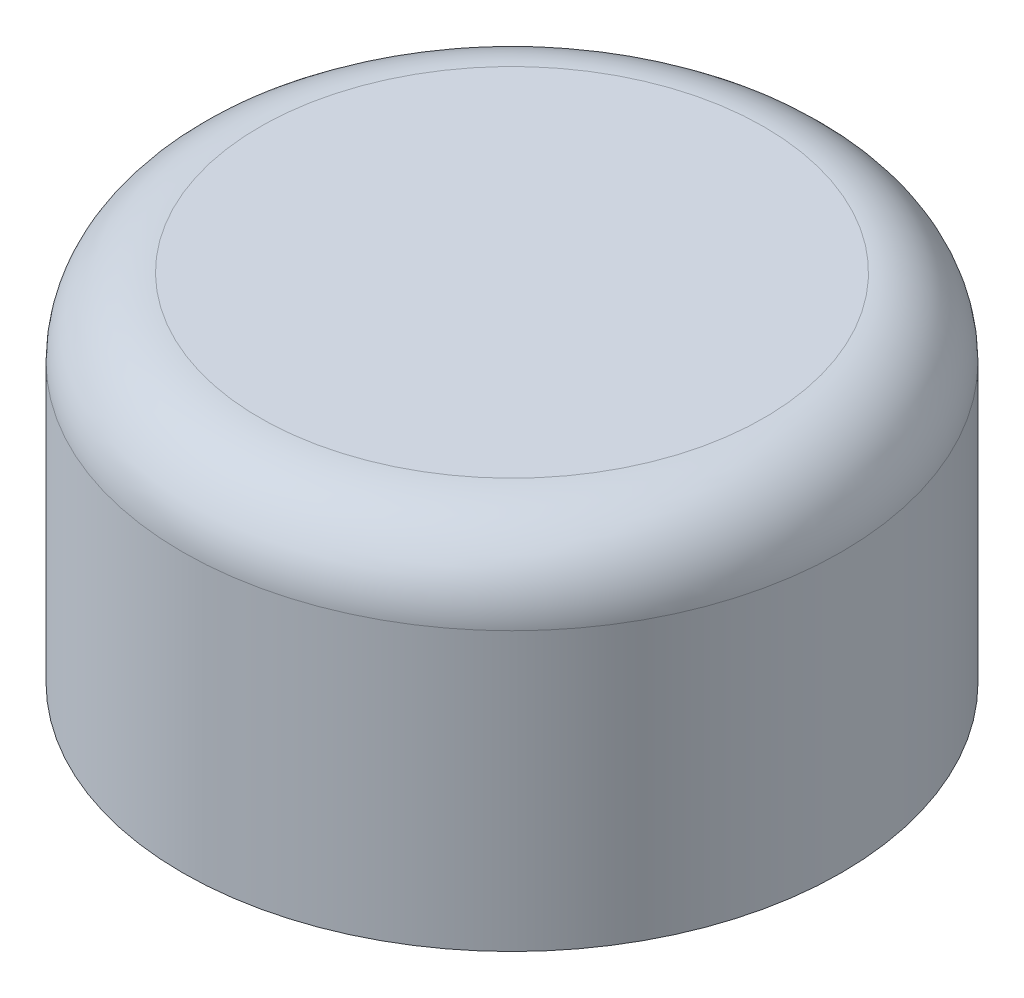
ISO-10303-21;
HEADER;
FILE_DESCRIPTION(('STEP AP214'),'2;1');
FILE_NAME('part.step','',(''),(''),'','','');
FILE_SCHEMA(('AUTOMOTIVE_DESIGN { 1 0 10303 214 1 1 1 1 }'));
ENDSEC;
DATA;
#1=APPLICATION_CONTEXT('core data for automotive mechanical design processes');
#2=APPLICATION_PROTOCOL_DEFINITION('international standard','automotive_design',2000,#1);
#3=PRODUCT_CONTEXT('',#1,'mechanical');
#4=PRODUCT('Part','Part','',(#3));
#5=PRODUCT_RELATED_PRODUCT_CATEGORY('part','',(#4));
#6=PRODUCT_DEFINITION_FORMATION('','',#4);
#7=PRODUCT_DEFINITION_CONTEXT('part definition',#1,'design');
#8=PRODUCT_DEFINITION('design','',#6,#7);
#9=PRODUCT_DEFINITION_SHAPE('','',#8);
#10=(LENGTH_UNIT() NAMED_UNIT(*) SI_UNIT(.MILLI.,.METRE.));
#11=(NAMED_UNIT(*) PLANE_ANGLE_UNIT() SI_UNIT($,.RADIAN.));
#12=(NAMED_UNIT(*) SI_UNIT($,.STERADIAN.) SOLID_ANGLE_UNIT());
#13=UNCERTAINTY_MEASURE_WITH_UNIT(LENGTH_MEASURE(1.E-05),#10,'distance_accuracy_value','');
#14=(GEOMETRIC_REPRESENTATION_CONTEXT(3) GLOBAL_UNCERTAINTY_ASSIGNED_CONTEXT((#13)) GLOBAL_UNIT_ASSIGNED_CONTEXT((#10,
#11,#12)) REPRESENTATION_CONTEXT('',''));
#15=CARTESIAN_POINT('',(0.,0.,0.));
#16=DIRECTION('',(0.,0.,1.));
#17=DIRECTION('',(1.,0.,0.));
#18=AXIS2_PLACEMENT_3D('',#15,#16,#17);
#19=CARTESIAN_POINT('',(0.,19.4,0.));
#20=DIRECTION('',(0.,-1.,0.));
#21=DIRECTION('',(0.,0.,-1.));
#22=AXIS2_PLACEMENT_3D('',#19,#20,#21);
#23=CYLINDRICAL_SURFACE('',#22,37.8500000000001);
#24=CARTESIAN_POINT('',(0.,0.,0.));
#25=DIRECTION('',(0.,1.,0.));
#26=DIRECTION('',(0.,0.,1.));
#27=AXIS2_PLACEMENT_3D('',#24,#25,#26);
#28=CIRCLE('',#27,37.8500000000001);
#29=CARTESIAN_POINT('',(0.,0.,37.8500000000001));
#30=VERTEX_POINT('',#29);
#31=EDGE_CURVE('E10',#30,#30,#28,.T.);
#32=ORIENTED_EDGE('',*,*,#31,.T.);
#33=EDGE_LOOP('',(#32));
#34=FACE_BOUND('',#33,.T.);
#35=CARTESIAN_POINT('',(0.,31.91000006,0.));
#36=DIRECTION('',(0.,-1.,0.));
#37=DIRECTION('',(0.,0.,-1.));
#38=AXIS2_PLACEMENT_3D('',#35,#36,#37);
#39=CIRCLE('',#38,37.8500000000001);
#40=CARTESIAN_POINT('',(0.,31.91000006,-37.8500000000001));
#41=VERTEX_POINT('',#40);
#42=EDGE_CURVE('E41',#41,#41,#39,.T.);
#43=ORIENTED_EDGE('',*,*,#42,.T.);
#44=EDGE_LOOP('',(#43));
#45=FACE_BOUND('',#44,.T.);
#46=ADVANCED_FACE('F35',(#34,#45),#23,.T.);
#47=CARTESIAN_POINT('',(0.,0.,0.));
#48=DIRECTION('',(0.,1.,0.));
#49=DIRECTION('',(0.,0.,1.));
#50=AXIS2_PLACEMENT_3D('',#47,#48,#49);
#51=PLANE('',#50);
#52=CARTESIAN_POINT('',(20.8596500450034,0.,-20.8596500450029));
#53=DIRECTION('',(0.,-1.,0.));
#54=DIRECTION('',(0.,0.,-1.));
#55=AXIS2_PLACEMENT_3D('',#52,#53,#54);
#56=CIRCLE('',#55,1.5);
#57=CARTESIAN_POINT('',(20.8596500450034,0.,-22.3596500450029));
#58=VERTEX_POINT('',#57);
#59=EDGE_CURVE('E61',#58,#58,#56,.T.);
#60=ORIENTED_EDGE('',*,*,#59,.F.);
#61=EDGE_LOOP('',(#60));
#62=FACE_BOUND('',#61,.T.);
#63=CARTESIAN_POINT('',(-20.8596500450031,0.,-20.8596500450032));
#64=DIRECTION('',(0.,-1.,0.));
#65=DIRECTION('',(0.,0.,-1.));
#66=AXIS2_PLACEMENT_3D('',#63,#64,#65);
#67=CIRCLE('',#66,1.5);
#68=CARTESIAN_POINT('',(-20.8596500450031,0.,-22.3596500450032));
#69=VERTEX_POINT('',#68);
#70=EDGE_CURVE('E67',#69,#69,#67,.T.);
#71=ORIENTED_EDGE('',*,*,#70,.F.);
#72=EDGE_LOOP('',(#71));
#73=FACE_BOUND('',#72,.T.);
#74=CARTESIAN_POINT('',(-20.8596500450032,0.,20.8596500450031));
#75=DIRECTION('',(0.,-1.,0.));
#76=DIRECTION('',(0.,0.,-1.));
#77=AXIS2_PLACEMENT_3D('',#74,#75,#76);
#78=CIRCLE('',#77,1.5);
#79=CARTESIAN_POINT('',(-20.8596500450032,0.,19.3596500450031));
#80=VERTEX_POINT('',#79);
#81=EDGE_CURVE('E55',#80,#80,#78,.T.);
#82=ORIENTED_EDGE('',*,*,#81,.F.);
#83=EDGE_LOOP('',(#82));
#84=FACE_BOUND('',#83,.T.);
#85=CARTESIAN_POINT('',(20.8596500450031,0.,20.8596500450032));
#86=DIRECTION('',(0.,-1.,0.));
#87=DIRECTION('',(0.,0.,-1.));
#88=AXIS2_PLACEMENT_3D('',#85,#86,#87);
#89=CIRCLE('',#88,1.5);
#90=CARTESIAN_POINT('',(20.8596500450031,0.,19.3596500450032));
#91=VERTEX_POINT('',#90);
#92=EDGE_CURVE('E52',#91,#91,#89,.T.);
#93=ORIENTED_EDGE('',*,*,#92,.F.);
#94=EDGE_LOOP('',(#93));
#95=FACE_BOUND('',#94,.T.);
#96=ORIENTED_EDGE('',*,*,#31,.F.);
#97=EDGE_LOOP('',(#96));
#98=FACE_BOUND('',#97,.T.);
#99=ADVANCED_FACE('F78',(#62,#73,#84,#95,#98),#51,.F.);
#100=CARTESIAN_POINT('',(0.,31.91000006,0.));
#101=DIRECTION('',(0.,-1.,0.));
#102=DIRECTION('',(0.,0.,-1.));
#103=AXIS2_PLACEMENT_3D('',#100,#101,#102);
#104=TOROIDAL_SURFACE('',#103,28.9600000000001,8.89);
#105=CARTESIAN_POINT('',(0.,40.80000006,0.));
#106=DIRECTION('',(0.,-1.,0.));
#107=DIRECTION('',(0.,0.,-1.));
#108=AXIS2_PLACEMENT_3D('',#105,#106,#107);
#109=CIRCLE('',#108,28.9600000000001);
#110=CARTESIAN_POINT('',(0.,40.80000006,-28.9600000000001));
#111=VERTEX_POINT('',#110);
#112=EDGE_CURVE('E45',#111,#111,#109,.T.);
#113=ORIENTED_EDGE('',*,*,#112,.T.);
#114=EDGE_LOOP('',(#113));
#115=FACE_BOUND('',#114,.T.);
#116=ORIENTED_EDGE('',*,*,#42,.F.);
#117=EDGE_LOOP('',(#116));
#118=FACE_BOUND('',#117,.T.);
#119=ADVANCED_FACE('F81',(#115,#118),#104,.T.);
#120=CARTESIAN_POINT('',(0.,40.80000006,-28.9600000000001));
#121=DIRECTION('',(0.,1.,0.));
#122=DIRECTION('',(0.,0.,1.));
#123=AXIS2_PLACEMENT_3D('',#120,#121,#122);
#124=PLANE('',#123);
#125=ORIENTED_EDGE('',*,*,#112,.F.);
#126=EDGE_LOOP('',(#125));
#127=FACE_BOUND('',#126,.T.);
#128=ADVANCED_FACE('F89',(#127),#124,.T.);
#129=CARTESIAN_POINT('',(20.8596500450031,1.,20.8596500450032));
#130=DIRECTION('',(0.,-1.,0.));
#131=DIRECTION('',(0.,0.,-1.));
#132=AXIS2_PLACEMENT_3D('',#129,#130,#131);
#133=CYLINDRICAL_SURFACE('',#132,1.5);
#134=CARTESIAN_POINT('',(20.8596500450031,1.,20.8596500450032));
#135=DIRECTION('',(0.,-1.,0.));
#136=DIRECTION('',(0.,0.,-1.));
#137=AXIS2_PLACEMENT_3D('',#134,#135,#136);
#138=CIRCLE('',#137,1.5);
#139=CARTESIAN_POINT('',(20.8596500450031,1.,19.3596500450032));
#140=VERTEX_POINT('',#139);
#141=EDGE_CURVE('E49',#140,#140,#138,.T.);
#142=ORIENTED_EDGE('',*,*,#141,.F.);
#143=EDGE_LOOP('',(#142));
#144=FACE_BOUND('',#143,.T.);
#145=ORIENTED_EDGE('',*,*,#92,.T.);
#146=EDGE_LOOP('',(#145));
#147=FACE_BOUND('',#146,.T.);
#148=ADVANCED_FACE('F86',(#144,#147),#133,.F.);
#149=CARTESIAN_POINT('',(20.8596500450031,1.,20.8596500450032));
#150=DIRECTION('',(0.,-1.,0.));
#151=DIRECTION('',(0.,0.,-1.));
#152=AXIS2_PLACEMENT_3D('',#149,#150,#151);
#153=PLANE('',#152);
#154=ORIENTED_EDGE('',*,*,#141,.T.);
#155=EDGE_LOOP('',(#154));
#156=FACE_BOUND('',#155,.T.);
#157=ADVANCED_FACE('F88',(#156),#153,.T.);
#158=CARTESIAN_POINT('',(-20.8596500450032,1.,20.8596500450031));
#159=DIRECTION('',(0.,-1.,0.));
#160=DIRECTION('',(0.,0.,-1.));
#161=AXIS2_PLACEMENT_3D('',#158,#159,#160);
#162=CYLINDRICAL_SURFACE('',#161,1.5);
#163=CARTESIAN_POINT('',(-20.8596500450032,1.,20.8596500450031));
#164=DIRECTION('',(0.,-1.,0.));
#165=DIRECTION('',(0.,0.,-1.));
#166=AXIS2_PLACEMENT_3D('',#163,#164,#165);
#167=CIRCLE('',#166,1.5);
#168=CARTESIAN_POINT('',(-20.8596500450032,1.,19.3596500450031));
#169=VERTEX_POINT('',#168);
#170=EDGE_CURVE('E70',#169,#169,#167,.T.);
#171=ORIENTED_EDGE('',*,*,#170,.F.);
#172=EDGE_LOOP('',(#171));
#173=FACE_BOUND('',#172,.T.);
#174=ORIENTED_EDGE('',*,*,#81,.T.);
#175=EDGE_LOOP('',(#174));
#176=FACE_BOUND('',#175,.T.);
#177=ADVANCED_FACE('F76',(#173,#176),#162,.F.);
#178=CARTESIAN_POINT('',(-20.8596500450032,1.,20.8596500450031));
#179=DIRECTION('',(0.,-1.,0.));
#180=DIRECTION('',(0.,0.,-1.));
#181=AXIS2_PLACEMENT_3D('',#178,#179,#180);
#182=PLANE('',#181);
#183=ORIENTED_EDGE('',*,*,#170,.T.);
#184=EDGE_LOOP('',(#183));
#185=FACE_BOUND('',#184,.T.);
#186=ADVANCED_FACE('F148',(#185),#182,.T.);
#187=CARTESIAN_POINT('',(-20.8596500450031,1.,-20.8596500450032));
#188=DIRECTION('',(0.,-1.,0.));
#189=DIRECTION('',(0.,0.,-1.));
#190=AXIS2_PLACEMENT_3D('',#187,#188,#189);
#191=CYLINDRICAL_SURFACE('',#190,1.5);
#192=CARTESIAN_POINT('',(-20.8596500450031,1.,-20.8596500450032));
#193=DIRECTION('',(0.,-1.,0.));
#194=DIRECTION('',(0.,0.,-1.));
#195=AXIS2_PLACEMENT_3D('',#192,#193,#194);
#196=CIRCLE('',#195,1.5);
#197=CARTESIAN_POINT('',(-20.8596500450031,1.,-22.3596500450032));
#198=VERTEX_POINT('',#197);
#199=EDGE_CURVE('E64',#198,#198,#196,.T.);
#200=ORIENTED_EDGE('',*,*,#199,.F.);
#201=EDGE_LOOP('',(#200));
#202=FACE_BOUND('',#201,.T.);
#203=ORIENTED_EDGE('',*,*,#70,.T.);
#204=EDGE_LOOP('',(#203));
#205=FACE_BOUND('',#204,.T.);
#206=ADVANCED_FACE('F159',(#202,#205),#191,.F.);
#207=CARTESIAN_POINT('',(-20.8596500450031,1.,-20.8596500450032));
#208=DIRECTION('',(0.,-1.,0.));
#209=DIRECTION('',(0.,0.,-1.));
#210=AXIS2_PLACEMENT_3D('',#207,#208,#209);
#211=PLANE('',#210);
#212=ORIENTED_EDGE('',*,*,#199,.T.);
#213=EDGE_LOOP('',(#212));
#214=FACE_BOUND('',#213,.T.);
#215=ADVANCED_FACE('F170',(#214),#211,.T.);
#216=CARTESIAN_POINT('',(20.8596500450034,1.,-20.8596500450029));
#217=DIRECTION('',(0.,-1.,0.));
#218=DIRECTION('',(0.,0.,-1.));
#219=AXIS2_PLACEMENT_3D('',#216,#217,#218);
#220=CYLINDRICAL_SURFACE('',#219,1.5);
#221=CARTESIAN_POINT('',(20.8596500450034,1.,-20.8596500450029));
#222=DIRECTION('',(0.,-1.,0.));
#223=DIRECTION('',(0.,0.,-1.));
#224=AXIS2_PLACEMENT_3D('',#221,#222,#223);
#225=CIRCLE('',#224,1.5);
#226=CARTESIAN_POINT('',(20.8596500450034,1.,-22.3596500450029));
#227=VERTEX_POINT('',#226);
#228=EDGE_CURVE('E58',#227,#227,#225,.T.);
#229=ORIENTED_EDGE('',*,*,#228,.F.);
#230=EDGE_LOOP('',(#229));
#231=FACE_BOUND('',#230,.T.);
#232=ORIENTED_EDGE('',*,*,#59,.T.);
#233=EDGE_LOOP('',(#232));
#234=FACE_BOUND('',#233,.T.);
#235=ADVANCED_FACE('F181',(#231,#234),#220,.F.);
#236=CARTESIAN_POINT('',(20.8596500450034,1.,-20.8596500450029));
#237=DIRECTION('',(0.,-1.,0.));
#238=DIRECTION('',(0.,0.,-1.));
#239=AXIS2_PLACEMENT_3D('',#236,#237,#238);
#240=PLANE('',#239);
#241=ORIENTED_EDGE('',*,*,#228,.T.);
#242=EDGE_LOOP('',(#241));
#243=FACE_BOUND('',#242,.T.);
#244=ADVANCED_FACE('F192',(#243),#240,.T.);
#245=CLOSED_SHELL('',(#46,#99,#119,#128,#148,#157,#177,#186,#206,#215,#235,#244));
#246=MANIFOLD_SOLID_BREP('B2',#245);
#247=ADVANCED_BREP_SHAPE_REPRESENTATION('',(#18,#246),#14);
#248=SHAPE_DEFINITION_REPRESENTATION(#9,#247);
ENDSEC;
END-ISO-10303-21;
